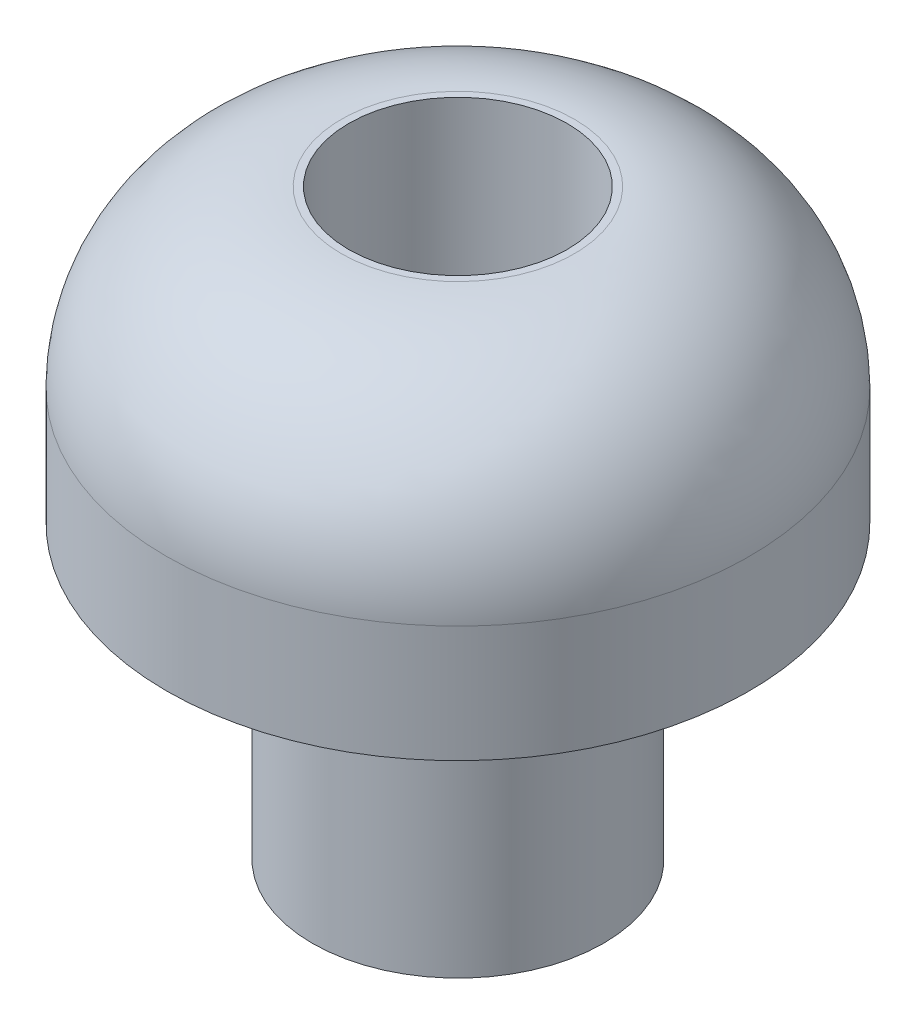
ISO-10303-21;
HEADER;
FILE_DESCRIPTION(('STEP AP214'),'2;1');
FILE_NAME('part.step','',(''),(''),'','','');
FILE_SCHEMA(('AUTOMOTIVE_DESIGN { 1 0 10303 214 1 1 1 1 }'));
ENDSEC;
DATA;
#1=APPLICATION_CONTEXT('core data for automotive mechanical design processes');
#2=APPLICATION_PROTOCOL_DEFINITION('international standard','automotive_design',2000,#1);
#3=PRODUCT_CONTEXT('',#1,'mechanical');
#4=PRODUCT('Part','Part','',(#3));
#5=PRODUCT_RELATED_PRODUCT_CATEGORY('part','',(#4));
#6=PRODUCT_DEFINITION_FORMATION('','',#4);
#7=PRODUCT_DEFINITION_CONTEXT('part definition',#1,'design');
#8=PRODUCT_DEFINITION('design','',#6,#7);
#9=PRODUCT_DEFINITION_SHAPE('','',#8);
#10=(LENGTH_UNIT() NAMED_UNIT(*) SI_UNIT(.MILLI.,.METRE.));
#11=(NAMED_UNIT(*) PLANE_ANGLE_UNIT() SI_UNIT($,.RADIAN.));
#12=(NAMED_UNIT(*) SI_UNIT($,.STERADIAN.) SOLID_ANGLE_UNIT());
#13=UNCERTAINTY_MEASURE_WITH_UNIT(LENGTH_MEASURE(1.E-05),#10,'distance_accuracy_value','');
#14=(GEOMETRIC_REPRESENTATION_CONTEXT(3) GLOBAL_UNCERTAINTY_ASSIGNED_CONTEXT((#13)) GLOBAL_UNIT_ASSIGNED_CONTEXT((#10,
#11,#12)) REPRESENTATION_CONTEXT('',''));
#15=CARTESIAN_POINT('',(0.,0.,0.));
#16=DIRECTION('',(0.,0.,1.));
#17=DIRECTION('',(1.,0.,0.));
#18=AXIS2_PLACEMENT_3D('',#15,#16,#17);
#19=CARTESIAN_POINT('',(0.,10.,0.));
#20=DIRECTION('',(0.,-1.,0.));
#21=DIRECTION('',(0.,0.,-1.));
#22=AXIS2_PLACEMENT_3D('',#19,#20,#21);
#23=CYLINDRICAL_SURFACE('',#22,10.);
#24=CARTESIAN_POINT('',(0.,4.,0.));
#25=DIRECTION('',(0.,1.,0.));
#26=DIRECTION('',(0.,0.,1.));
#27=AXIS2_PLACEMENT_3D('',#24,#25,#26);
#28=CIRCLE('',#27,10.);
#29=CARTESIAN_POINT('',(0.,4.,10.));
#30=VERTEX_POINT('',#29);
#31=EDGE_CURVE('E47',#30,#30,#28,.F.);
#32=ORIENTED_EDGE('',*,*,#31,.T.);
#33=EDGE_LOOP('',(#32));
#34=FACE_BOUND('',#33,.T.);
#35=CARTESIAN_POINT('',(0.,0.,0.));
#36=DIRECTION('',(0.,1.,0.));
#37=DIRECTION('',(0.,0.,1.));
#38=AXIS2_PLACEMENT_3D('',#35,#36,#37);
#39=CIRCLE('',#38,10.);
#40=CARTESIAN_POINT('',(0.,0.,10.));
#41=VERTEX_POINT('',#40);
#42=EDGE_CURVE('E62',#41,#41,#39,.T.);
#43=ORIENTED_EDGE('',*,*,#42,.T.);
#44=EDGE_LOOP('',(#43));
#45=FACE_BOUND('',#44,.T.);
#46=ADVANCED_FACE('F43',(#34,#45),#23,.T.);
#47=CARTESIAN_POINT('',(0.,10.,0.));
#48=DIRECTION('',(0.,1.,0.));
#49=DIRECTION('',(0.,0.,1.));
#50=AXIS2_PLACEMENT_3D('',#47,#48,#49);
#51=PLANE('',#50);
#52=CARTESIAN_POINT('',(0.,10.,0.));
#53=DIRECTION('',(0.,1.,0.));
#54=DIRECTION('',(0.,0.,1.));
#55=AXIS2_PLACEMENT_3D('',#52,#53,#54);
#56=CIRCLE('',#55,3.75);
#57=CARTESIAN_POINT('',(0.,10.,3.75));
#58=VERTEX_POINT('',#57);
#59=EDGE_CURVE('E118',#58,#58,#56,.T.);
#60=ORIENTED_EDGE('',*,*,#59,.F.);
#61=EDGE_LOOP('',(#60));
#62=FACE_BOUND('',#61,.T.);
#63=CARTESIAN_POINT('',(0.,10.,0.));
#64=DIRECTION('',(0.,1.,0.));
#65=DIRECTION('',(0.,0.,1.));
#66=AXIS2_PLACEMENT_3D('',#63,#64,#65);
#67=CIRCLE('',#66,4.);
#68=CARTESIAN_POINT('',(0.,10.,4.));
#69=VERTEX_POINT('',#68);
#70=EDGE_CURVE('E57',#69,#69,#67,.T.);
#71=ORIENTED_EDGE('',*,*,#70,.T.);
#72=EDGE_LOOP('',(#71));
#73=FACE_BOUND('',#72,.T.);
#74=ADVANCED_FACE('F69',(#62,#73),#51,.T.);
#75=CARTESIAN_POINT('',(0.,0.,0.));
#76=DIRECTION('',(0.,1.,0.));
#77=DIRECTION('',(0.,0.,1.));
#78=AXIS2_PLACEMENT_3D('',#75,#76,#77);
#79=PLANE('',#78);
#80=CARTESIAN_POINT('',(0.,0.,0.));
#81=DIRECTION('',(0.,-1.,0.));
#82=DIRECTION('',(0.,0.,-1.));
#83=AXIS2_PLACEMENT_3D('',#80,#81,#82);
#84=CIRCLE('',#83,5.);
#85=CARTESIAN_POINT('',(0.,0.,-5.));
#86=VERTEX_POINT('',#85);
#87=EDGE_CURVE('E11',#86,#86,#84,.T.);
#88=ORIENTED_EDGE('',*,*,#87,.F.);
#89=EDGE_LOOP('',(#88));
#90=FACE_BOUND('',#89,.T.);
#91=ORIENTED_EDGE('',*,*,#42,.F.);
#92=EDGE_LOOP('',(#91));
#93=FACE_BOUND('',#92,.T.);
#94=ADVANCED_FACE('F73',(#90,#93),#79,.F.);
#95=CARTESIAN_POINT('',(0.,4.,0.));
#96=DIRECTION('',(0.,1.,0.));
#97=DIRECTION('',(0.,0.,1.));
#98=AXIS2_PLACEMENT_3D('',#95,#96,#97);
#99=DEGENERATE_TOROIDAL_SURFACE('',#98,4.,6.,.T.);
#100=ORIENTED_EDGE('',*,*,#31,.F.);
#101=EDGE_LOOP('',(#100));
#102=FACE_BOUND('',#101,.T.);
#103=ORIENTED_EDGE('',*,*,#70,.F.);
#104=EDGE_LOOP('',(#103));
#105=FACE_BOUND('',#104,.T.);
#106=ADVANCED_FACE('F45',(#102,#105),#99,.T.);
#107=CARTESIAN_POINT('',(0.,-10.,0.));
#108=DIRECTION('',(0.,1.,0.));
#109=DIRECTION('',(0.,0.,1.));
#110=AXIS2_PLACEMENT_3D('',#107,#108,#109);
#111=CYLINDRICAL_SURFACE('',#110,5.);
#112=CARTESIAN_POINT('',(0.,-10.,0.));
#113=DIRECTION('',(0.,-1.,0.));
#114=DIRECTION('',(0.,0.,-1.));
#115=AXIS2_PLACEMENT_3D('',#112,#113,#114);
#116=CIRCLE('',#115,5.);
#117=CARTESIAN_POINT('',(0.,-10.,-5.));
#118=VERTEX_POINT('',#117);
#119=EDGE_CURVE('E60',#118,#118,#116,.T.);
#120=ORIENTED_EDGE('',*,*,#119,.F.);
#121=EDGE_LOOP('',(#120));
#122=FACE_BOUND('',#121,.T.);
#123=ORIENTED_EDGE('',*,*,#87,.T.);
#124=EDGE_LOOP('',(#123));
#125=FACE_BOUND('',#124,.T.);
#126=ADVANCED_FACE('F72',(#122,#125),#111,.T.);
#127=CARTESIAN_POINT('',(0.,-10.,0.));
#128=DIRECTION('',(0.,-1.,0.));
#129=DIRECTION('',(0.,0.,-1.));
#130=AXIS2_PLACEMENT_3D('',#127,#128,#129);
#131=PLANE('',#130);
#132=CARTESIAN_POINT('',(0.,-10.,0.));
#133=DIRECTION('',(0.,-1.,0.));
#134=DIRECTION('',(0.,0.,-1.));
#135=AXIS2_PLACEMENT_3D('',#132,#133,#134);
#136=CIRCLE('',#135,1.6);
#137=CARTESIAN_POINT('',(0.,-10.,-1.6));
#138=VERTEX_POINT('',#137);
#139=EDGE_CURVE('E116',#138,#138,#136,.T.);
#140=ORIENTED_EDGE('',*,*,#139,.F.);
#141=EDGE_LOOP('',(#140));
#142=FACE_BOUND('',#141,.T.);
#143=ORIENTED_EDGE('',*,*,#119,.T.);
#144=EDGE_LOOP('',(#143));
#145=FACE_BOUND('',#144,.T.);
#146=ADVANCED_FACE('F79',(#142,#145),#131,.T.);
#147=CARTESIAN_POINT('',(0.,-10.6066017177982,0.));
#148=DIRECTION('',(0.,1.,0.));
#149=DIRECTION('',(0.,0.,1.));
#150=AXIS2_PLACEMENT_3D('',#147,#148,#149);
#151=CYLINDRICAL_SURFACE('',#150,3.75);
#152=CARTESIAN_POINT('',(0.,2.,0.));
#153=DIRECTION('',(0.,1.,0.));
#154=DIRECTION('',(0.,0.,1.));
#155=AXIS2_PLACEMENT_3D('',#152,#153,#154);
#156=CIRCLE('',#155,3.75);
#157=CARTESIAN_POINT('',(0.,2.,3.75));
#158=VERTEX_POINT('',#157);
#159=EDGE_CURVE('E123',#158,#158,#156,.F.);
#160=ORIENTED_EDGE('',*,*,#159,.T.);
#161=EDGE_LOOP('',(#160));
#162=FACE_BOUND('',#161,.T.);
#163=ORIENTED_EDGE('',*,*,#59,.T.);
#164=EDGE_LOOP('',(#163));
#165=FACE_BOUND('',#164,.T.);
#166=ADVANCED_FACE('F96',(#162,#165),#151,.F.);
#167=CARTESIAN_POINT('',(0.,2.,0.));
#168=DIRECTION('',(0.,1.,0.));
#169=DIRECTION('',(0.,0.,1.));
#170=AXIS2_PLACEMENT_3D('',#167,#168,#169);
#171=PLANE('',#170);
#172=CARTESIAN_POINT('',(0.,2.,0.));
#173=DIRECTION('',(0.,1.,0.));
#174=DIRECTION('',(0.,0.,1.));
#175=AXIS2_PLACEMENT_3D('',#172,#173,#174);
#176=CIRCLE('',#175,1.6);
#177=CARTESIAN_POINT('',(0.,2.,1.6));
#178=VERTEX_POINT('',#177);
#179=EDGE_CURVE('E113',#178,#178,#176,.F.);
#180=ORIENTED_EDGE('',*,*,#179,.T.);
#181=EDGE_LOOP('',(#180));
#182=FACE_BOUND('',#181,.T.);
#183=ORIENTED_EDGE('',*,*,#159,.F.);
#184=EDGE_LOOP('',(#183));
#185=FACE_BOUND('',#184,.T.);
#186=ADVANCED_FACE('F100',(#182,#185),#171,.T.);
#187=CARTESIAN_POINT('',(0.,10.001,0.));
#188=DIRECTION('',(0.,-1.,0.));
#189=DIRECTION('',(0.,0.,-1.));
#190=AXIS2_PLACEMENT_3D('',#187,#188,#189);
#191=CYLINDRICAL_SURFACE('',#190,1.6);
#192=ORIENTED_EDGE('',*,*,#179,.F.);
#193=EDGE_LOOP('',(#192));
#194=FACE_BOUND('',#193,.T.);
#195=ORIENTED_EDGE('',*,*,#139,.T.);
#196=EDGE_LOOP('',(#195));
#197=FACE_BOUND('',#196,.T.);
#198=ADVANCED_FACE('F104',(#194,#197),#191,.F.);
#199=CLOSED_SHELL('',(#46,#74,#94,#106,#126,#146,#166,#186,#198));
#200=MANIFOLD_SOLID_BREP('B2',#199);
#201=ADVANCED_BREP_SHAPE_REPRESENTATION('',(#18,#200),#14);
#202=SHAPE_DEFINITION_REPRESENTATION(#9,#201);
ENDSEC;
END-ISO-10303-21;
